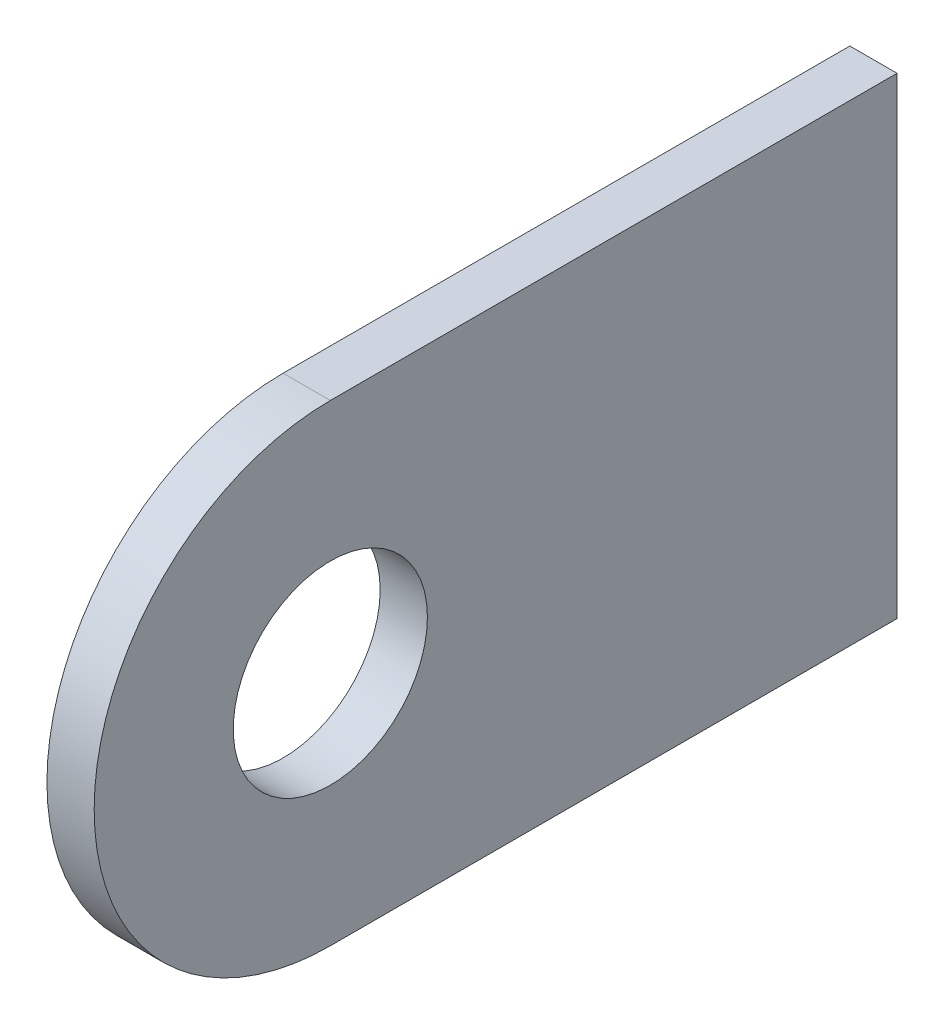
ISO-10303-21;
HEADER;
FILE_DESCRIPTION(('STEP AP214'),'2;1');
FILE_NAME('part.step','',(''),(''),'','','');
FILE_SCHEMA(('AUTOMOTIVE_DESIGN { 1 0 10303 214 1 1 1 1 }'));
ENDSEC;
DATA;
#1=APPLICATION_CONTEXT('core data for automotive mechanical design processes');
#2=APPLICATION_PROTOCOL_DEFINITION('international standard','automotive_design',2000,#1);
#3=PRODUCT_CONTEXT('',#1,'mechanical');
#4=PRODUCT('Part','Part','',(#3));
#5=PRODUCT_RELATED_PRODUCT_CATEGORY('part','',(#4));
#6=PRODUCT_DEFINITION_FORMATION('','',#4);
#7=PRODUCT_DEFINITION_CONTEXT('part definition',#1,'design');
#8=PRODUCT_DEFINITION('design','',#6,#7);
#9=PRODUCT_DEFINITION_SHAPE('','',#8);
#10=(LENGTH_UNIT() NAMED_UNIT(*) SI_UNIT(.MILLI.,.METRE.));
#11=(NAMED_UNIT(*) PLANE_ANGLE_UNIT() SI_UNIT($,.RADIAN.));
#12=(NAMED_UNIT(*) SI_UNIT($,.STERADIAN.) SOLID_ANGLE_UNIT());
#13=UNCERTAINTY_MEASURE_WITH_UNIT(LENGTH_MEASURE(1.E-05),#10,'distance_accuracy_value','');
#14=(GEOMETRIC_REPRESENTATION_CONTEXT(3) GLOBAL_UNCERTAINTY_ASSIGNED_CONTEXT((#13)) GLOBAL_UNIT_ASSIGNED_CONTEXT((#10,
#11,#12)) REPRESENTATION_CONTEXT('',''));
#15=CARTESIAN_POINT('',(0.,0.,0.));
#16=DIRECTION('',(0.,0.,1.));
#17=DIRECTION('',(1.,0.,0.));
#18=AXIS2_PLACEMENT_3D('',#15,#16,#17);
#19=CARTESIAN_POINT('',(1.5875,7.93749999999761,19.05));
#20=DIRECTION('',(0.,-1.,0.));
#21=DIRECTION('',(0.,0.,-1.));
#22=AXIS2_PLACEMENT_3D('',#19,#20,#21);
#23=PLANE('',#22);
#24=DIRECTION('',(0.,0.,1.));
#25=VECTOR('',#24,1.);
#26=CARTESIAN_POINT('',(0.,7.93749999999761,19.05));
#27=LINE('',#26,#25);
#28=CARTESIAN_POINT('',(0.,7.93749999999761,0.));
#29=VERTEX_POINT('',#28);
#30=CARTESIAN_POINT('',(0.,7.9374999999976,19.05));
#31=VERTEX_POINT('',#30);
#32=EDGE_CURVE('E116',#29,#31,#27,.T.);
#33=ORIENTED_EDGE('',*,*,#32,.T.);
#34=DIRECTION('',(-1.,0.,0.));
#35=VECTOR('',#34,1.);
#36=CARTESIAN_POINT('',(1.5875,7.9374999999976,19.05));
#37=LINE('',#36,#35);
#38=CARTESIAN_POINT('',(1.5875,7.9374999999976,19.05));
#39=VERTEX_POINT('',#38);
#40=EDGE_CURVE('E12',#39,#31,#37,.T.);
#41=ORIENTED_EDGE('',*,*,#40,.F.);
#42=DIRECTION('',(0.,0.,1.));
#43=VECTOR('',#42,1.);
#44=CARTESIAN_POINT('',(1.5875,7.93749999999761,19.05));
#45=LINE('',#44,#43);
#46=CARTESIAN_POINT('',(1.5875,7.93749999999761,0.));
#47=VERTEX_POINT('',#46);
#48=EDGE_CURVE('E90',#47,#39,#45,.T.);
#49=ORIENTED_EDGE('',*,*,#48,.F.);
#50=DIRECTION('',(-1.,0.,0.));
#51=VECTOR('',#50,1.);
#52=CARTESIAN_POINT('',(1.5875,7.93749999999761,0.));
#53=LINE('',#52,#51);
#54=EDGE_CURVE('E101',#47,#29,#53,.T.);
#55=ORIENTED_EDGE('',*,*,#54,.T.);
#56=EDGE_LOOP('',(#33,#41,#49,#55));
#57=FACE_BOUND('',#56,.T.);
#58=ADVANCED_FACE('F39',(#57),#23,.F.);
#59=CARTESIAN_POINT('',(1.5875,0.,19.05));
#60=DIRECTION('',(-1.,0.,0.));
#61=DIRECTION('',(0.,0.,1.));
#62=AXIS2_PLACEMENT_3D('',#59,#60,#61);
#63=CYLINDRICAL_SURFACE('',#62,7.93749999999761);
#64=CARTESIAN_POINT('',(0.,0.,19.05));
#65=DIRECTION('',(1.,0.,0.));
#66=DIRECTION('',(0.,0.,1.));
#67=AXIS2_PLACEMENT_3D('',#64,#65,#66);
#68=CIRCLE('',#67,7.93749999999761);
#69=CARTESIAN_POINT('',(0.,-7.93749999999761,19.05));
#70=VERTEX_POINT('',#69);
#71=EDGE_CURVE('E95',#31,#70,#68,.T.);
#72=ORIENTED_EDGE('',*,*,#71,.T.);
#73=DIRECTION('',(-1.,0.,0.));
#74=VECTOR('',#73,1.);
#75=CARTESIAN_POINT('',(1.5875,-7.93749999999761,19.05));
#76=LINE('',#75,#74);
#77=CARTESIAN_POINT('',(1.5875,-7.93749999999761,19.05));
#78=VERTEX_POINT('',#77);
#79=EDGE_CURVE('E47',#78,#70,#76,.T.);
#80=ORIENTED_EDGE('',*,*,#79,.F.);
#81=CARTESIAN_POINT('',(1.5875,0.,19.05));
#82=DIRECTION('',(1.,0.,0.));
#83=DIRECTION('',(0.,0.,1.));
#84=AXIS2_PLACEMENT_3D('',#81,#82,#83);
#85=CIRCLE('',#84,7.93749999999761);
#86=EDGE_CURVE('E85',#39,#78,#85,.T.);
#87=ORIENTED_EDGE('',*,*,#86,.F.);
#88=ORIENTED_EDGE('',*,*,#40,.T.);
#89=EDGE_LOOP('',(#72,#80,#87,#88));
#90=FACE_BOUND('',#89,.T.);
#91=ADVANCED_FACE('F94',(#90),#63,.T.);
#92=CARTESIAN_POINT('',(1.5875,-7.93749999999761,19.05));
#93=DIRECTION('',(0.,1.,0.));
#94=DIRECTION('',(0.,0.,1.));
#95=AXIS2_PLACEMENT_3D('',#92,#93,#94);
#96=PLANE('',#95);
#97=DIRECTION('',(0.,0.,-1.));
#98=VECTOR('',#97,1.);
#99=CARTESIAN_POINT('',(0.,-7.93749999999761,19.05));
#100=LINE('',#99,#98);
#101=CARTESIAN_POINT('',(0.,-7.93749999999761,0.));
#102=VERTEX_POINT('',#101);
#103=EDGE_CURVE('E72',#70,#102,#100,.T.);
#104=ORIENTED_EDGE('',*,*,#103,.T.);
#105=DIRECTION('',(-1.,0.,0.));
#106=VECTOR('',#105,1.);
#107=CARTESIAN_POINT('',(1.5875,-7.93749999999761,0.));
#108=LINE('',#107,#106);
#109=CARTESIAN_POINT('',(1.5875,-7.93749999999761,0.));
#110=VERTEX_POINT('',#109);
#111=EDGE_CURVE('E96',#110,#102,#108,.T.);
#112=ORIENTED_EDGE('',*,*,#111,.F.);
#113=DIRECTION('',(0.,0.,-1.));
#114=VECTOR('',#113,1.);
#115=CARTESIAN_POINT('',(1.5875,-7.93749999999761,19.05));
#116=LINE('',#115,#114);
#117=EDGE_CURVE('E88',#78,#110,#116,.T.);
#118=ORIENTED_EDGE('',*,*,#117,.F.);
#119=ORIENTED_EDGE('',*,*,#79,.T.);
#120=EDGE_LOOP('',(#104,#112,#118,#119));
#121=FACE_BOUND('',#120,.T.);
#122=ADVANCED_FACE('F97',(#121),#96,.F.);
#123=CARTESIAN_POINT('',(1.5875,-7.93749999999761,0.));
#124=DIRECTION('',(0.,0.,1.));
#125=DIRECTION('',(0.,-1.,0.));
#126=AXIS2_PLACEMENT_3D('',#123,#124,#125);
#127=PLANE('',#126);
#128=DIRECTION('',(0.,1.,0.));
#129=VECTOR('',#128,1.);
#130=CARTESIAN_POINT('',(0.,-7.93749999999761,0.));
#131=LINE('',#130,#129);
#132=EDGE_CURVE('E78',#102,#29,#131,.T.);
#133=ORIENTED_EDGE('',*,*,#132,.T.);
#134=ORIENTED_EDGE('',*,*,#54,.F.);
#135=DIRECTION('',(0.,1.,0.));
#136=VECTOR('',#135,1.);
#137=CARTESIAN_POINT('',(1.5875,-7.93749999999761,0.));
#138=LINE('',#137,#136);
#139=EDGE_CURVE('E55',#110,#47,#138,.T.);
#140=ORIENTED_EDGE('',*,*,#139,.F.);
#141=ORIENTED_EDGE('',*,*,#111,.T.);
#142=EDGE_LOOP('',(#133,#134,#140,#141));
#143=FACE_BOUND('',#142,.T.);
#144=ADVANCED_FACE('F127',(#143),#127,.F.);
#145=CARTESIAN_POINT('',(1.5875,0.,19.05));
#146=DIRECTION('',(-1.,0.,0.));
#147=DIRECTION('',(0.,0.,1.));
#148=AXIS2_PLACEMENT_3D('',#145,#146,#147);
#149=PLANE('',#148);
#150=CARTESIAN_POINT('',(1.5875,0.,19.05));
#151=DIRECTION('',(1.,0.,0.));
#152=DIRECTION('',(0.,0.,-1.));
#153=AXIS2_PLACEMENT_3D('',#150,#151,#152);
#154=CIRCLE('',#153,3.2639);
#155=CARTESIAN_POINT('',(1.5875,0.,15.7861));
#156=VERTEX_POINT('',#155);
#157=EDGE_CURVE('E117',#156,#156,#154,.T.);
#158=ORIENTED_EDGE('',*,*,#157,.F.);
#159=EDGE_LOOP('',(#158));
#160=FACE_BOUND('',#159,.T.);
#161=ORIENTED_EDGE('',*,*,#48,.T.);
#162=ORIENTED_EDGE('',*,*,#86,.T.);
#163=ORIENTED_EDGE('',*,*,#117,.T.);
#164=ORIENTED_EDGE('',*,*,#139,.T.);
#165=EDGE_LOOP('',(#161,#162,#163,#164));
#166=FACE_BOUND('',#165,.T.);
#167=ADVANCED_FACE('F86',(#160,#166),#149,.F.);
#168=CARTESIAN_POINT('',(0.,0.,19.05));
#169=DIRECTION('',(-1.,0.,0.));
#170=DIRECTION('',(0.,0.,1.));
#171=AXIS2_PLACEMENT_3D('',#168,#169,#170);
#172=PLANE('',#171);
#173=CARTESIAN_POINT('',(0.,0.,19.05));
#174=DIRECTION('',(1.,0.,0.));
#175=DIRECTION('',(0.,0.,-1.));
#176=AXIS2_PLACEMENT_3D('',#173,#174,#175);
#177=CIRCLE('',#176,3.2639);
#178=CARTESIAN_POINT('',(0.,0.,15.7861));
#179=VERTEX_POINT('',#178);
#180=EDGE_CURVE('E114',#179,#179,#177,.T.);
#181=ORIENTED_EDGE('',*,*,#180,.T.);
#182=EDGE_LOOP('',(#181));
#183=FACE_BOUND('',#182,.T.);
#184=ORIENTED_EDGE('',*,*,#32,.F.);
#185=ORIENTED_EDGE('',*,*,#132,.F.);
#186=ORIENTED_EDGE('',*,*,#103,.F.);
#187=ORIENTED_EDGE('',*,*,#71,.F.);
#188=EDGE_LOOP('',(#184,#185,#186,#187));
#189=FACE_BOUND('',#188,.T.);
#190=ADVANCED_FACE('F126',(#183,#189),#172,.T.);
#191=CARTESIAN_POINT('',(1.5875,0.,19.05));
#192=DIRECTION('',(1.,0.,0.));
#193=DIRECTION('',(0.,0.,-1.));
#194=AXIS2_PLACEMENT_3D('',#191,#192,#193);
#195=CYLINDRICAL_SURFACE('',#194,3.2639);
#196=ORIENTED_EDGE('',*,*,#180,.F.);
#197=EDGE_LOOP('',(#196));
#198=FACE_BOUND('',#197,.T.);
#199=ORIENTED_EDGE('',*,*,#157,.T.);
#200=EDGE_LOOP('',(#199));
#201=FACE_BOUND('',#200,.T.);
#202=ADVANCED_FACE('F123',(#198,#201),#195,.F.);
#203=CLOSED_SHELL('',(#58,#91,#122,#144,#167,#190,#202));
#204=MANIFOLD_SOLID_BREP('B2',#203);
#205=ADVANCED_BREP_SHAPE_REPRESENTATION('',(#18,#204),#14);
#206=SHAPE_DEFINITION_REPRESENTATION(#9,#205);
ENDSEC;
END-ISO-10303-21;
